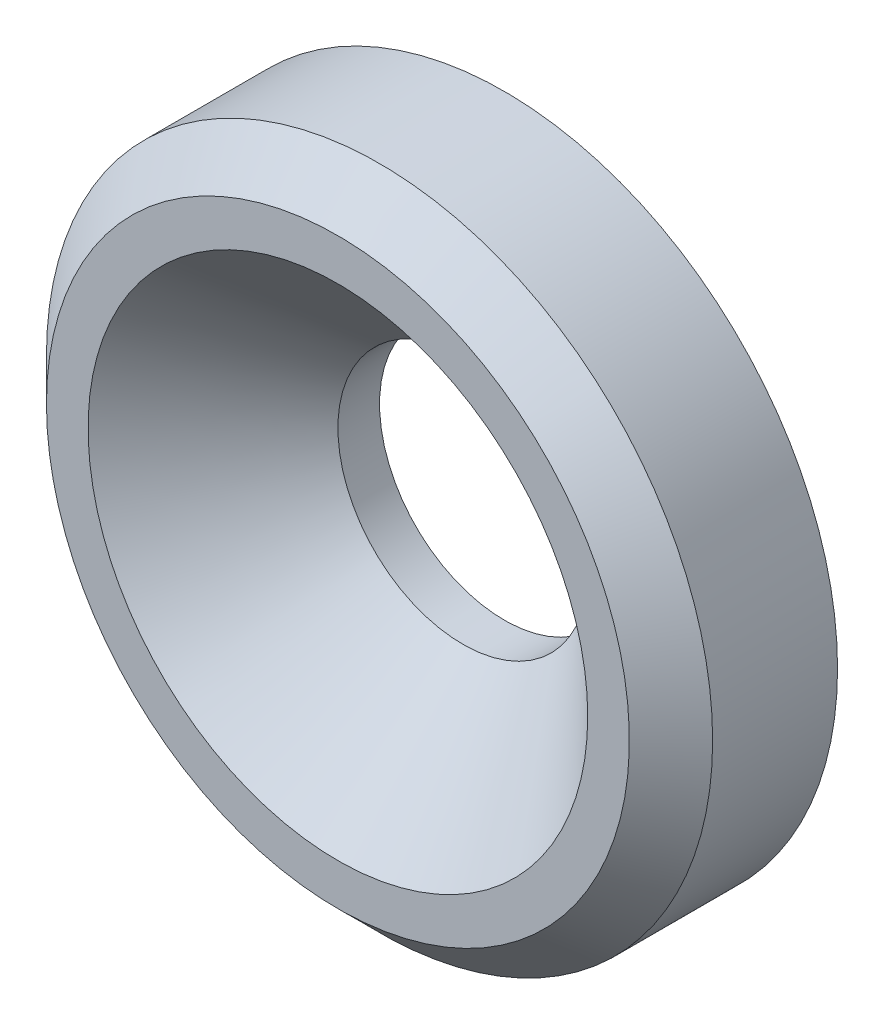
ISO-10303-21;
HEADER;
FILE_DESCRIPTION(('STEP AP214'),'2;1');
FILE_NAME('part.step','',(''),(''),'','','');
FILE_SCHEMA(('AUTOMOTIVE_DESIGN { 1 0 10303 214 1 1 1 1 }'));
ENDSEC;
DATA;
#1=APPLICATION_CONTEXT('core data for automotive mechanical design processes');
#2=APPLICATION_PROTOCOL_DEFINITION('international standard','automotive_design',2000,#1);
#3=PRODUCT_CONTEXT('',#1,'mechanical');
#4=PRODUCT('Part','Part','',(#3));
#5=PRODUCT_RELATED_PRODUCT_CATEGORY('part','',(#4));
#6=PRODUCT_DEFINITION_FORMATION('','',#4);
#7=PRODUCT_DEFINITION_CONTEXT('part definition',#1,'design');
#8=PRODUCT_DEFINITION('design','',#6,#7);
#9=PRODUCT_DEFINITION_SHAPE('','',#8);
#10=(LENGTH_UNIT() NAMED_UNIT(*) SI_UNIT(.MILLI.,.METRE.));
#11=(NAMED_UNIT(*) PLANE_ANGLE_UNIT() SI_UNIT($,.RADIAN.));
#12=(NAMED_UNIT(*) SI_UNIT($,.STERADIAN.) SOLID_ANGLE_UNIT());
#13=UNCERTAINTY_MEASURE_WITH_UNIT(LENGTH_MEASURE(1.E-05),#10,'distance_accuracy_value','');
#14=(GEOMETRIC_REPRESENTATION_CONTEXT(3) GLOBAL_UNCERTAINTY_ASSIGNED_CONTEXT((#13)) GLOBAL_UNIT_ASSIGNED_CONTEXT((#10,
#11,#12)) REPRESENTATION_CONTEXT('',''));
#15=CARTESIAN_POINT('',(0.,0.,0.));
#16=DIRECTION('',(0.,0.,1.));
#17=DIRECTION('',(1.,0.,0.));
#18=AXIS2_PLACEMENT_3D('',#15,#16,#17);
#19=CARTESIAN_POINT('',(0.,0.,2.));
#20=DIRECTION('',(0.,0.,1.));
#21=DIRECTION('',(1.,0.,0.));
#22=AXIS2_PLACEMENT_3D('',#19,#20,#21);
#23=PLANE('',#22);
#24=CARTESIAN_POINT('',(0.,0.,2.00000000000955));
#25=DIRECTION('',(0.,0.,1.));
#26=DIRECTION('',(1.,0.,0.));
#27=AXIS2_PLACEMENT_3D('',#24,#25,#26);
#28=CIRCLE('',#27,2.9999999999859);
#29=CARTESIAN_POINT('',(2.9999999999859,0.,2.00000000000955));
#30=VERTEX_POINT('',#29);
#31=EDGE_CURVE('E32',#30,#30,#28,.F.);
#32=ORIENTED_EDGE('',*,*,#31,.T.);
#33=EDGE_LOOP('',(#32));
#34=FACE_BOUND('',#33,.T.);
#35=CARTESIAN_POINT('',(0.,0.,2.00000000000955));
#36=DIRECTION('',(0.,0.,-1.));
#37=DIRECTION('',(-1.,0.,0.));
#38=AXIS2_PLACEMENT_3D('',#35,#36,#37);
#39=CIRCLE('',#38,3.49999999997408);
#40=CARTESIAN_POINT('',(-3.49999999997408,0.,2.00000000000955));
#41=VERTEX_POINT('',#40);
#42=EDGE_CURVE('E18',#41,#41,#39,.T.);
#43=ORIENTED_EDGE('',*,*,#42,.F.);
#44=EDGE_LOOP('',(#43));
#45=FACE_BOUND('',#44,.T.);
#46=ADVANCED_FACE('F15',(#34,#45),#23,.T.);
#47=CARTESIAN_POINT('',(0.,0.,1.50000000007822));
#48=DIRECTION('',(0.,0.,-1.));
#49=DIRECTION('',(-1.,0.,0.));
#50=AXIS2_PLACEMENT_3D('',#47,#48,#49);
#51=CONICAL_SURFACE('',#50,3.99999999990541,0.785398163397448);
#52=CARTESIAN_POINT('',(0.,0.,1.5));
#53=DIRECTION('',(0.,0.,1.));
#54=DIRECTION('',(1.,0.,0.));
#55=AXIS2_PLACEMENT_3D('',#52,#53,#54);
#56=CIRCLE('',#55,4.);
#57=CARTESIAN_POINT('',(4.,0.,1.5));
#58=VERTEX_POINT('',#57);
#59=EDGE_CURVE('E30',#58,#58,#56,.F.);
#60=ORIENTED_EDGE('',*,*,#59,.F.);
#61=EDGE_LOOP('',(#60));
#62=FACE_BOUND('',#61,.T.);
#63=ORIENTED_EDGE('',*,*,#42,.T.);
#64=EDGE_LOOP('',(#63));
#65=FACE_BOUND('',#64,.T.);
#66=ADVANCED_FACE('F40',(#62,#65),#51,.T.);
#67=CARTESIAN_POINT('',(0.,0.,2.00000000000955));
#68=DIRECTION('',(0.,0.,1.));
#69=DIRECTION('',(1.,0.,0.));
#70=AXIS2_PLACEMENT_3D('',#67,#68,#69);
#71=CONICAL_SURFACE('',#70,2.9999999999859,0.785398163397448);
#72=CARTESIAN_POINT('',(0.,0.,0.5));
#73=DIRECTION('',(0.,0.,1.));
#74=DIRECTION('',(1.,0.,0.));
#75=AXIS2_PLACEMENT_3D('',#72,#73,#74);
#76=CIRCLE('',#75,1.5);
#77=CARTESIAN_POINT('',(1.5,0.,0.5));
#78=VERTEX_POINT('',#77);
#79=EDGE_CURVE('E27',#78,#78,#76,.F.);
#80=ORIENTED_EDGE('',*,*,#79,.T.);
#81=EDGE_LOOP('',(#80));
#82=FACE_BOUND('',#81,.T.);
#83=ORIENTED_EDGE('',*,*,#31,.F.);
#84=EDGE_LOOP('',(#83));
#85=FACE_BOUND('',#84,.T.);
#86=ADVANCED_FACE('F47',(#82,#85),#71,.F.);
#87=CARTESIAN_POINT('',(0.,0.,0.));
#88=DIRECTION('',(0.,0.,1.));
#89=DIRECTION('',(1.,0.,0.));
#90=AXIS2_PLACEMENT_3D('',#87,#88,#89);
#91=CYLINDRICAL_SURFACE('',#90,4.);
#92=CARTESIAN_POINT('',(0.,0.,0.));
#93=DIRECTION('',(0.,0.,1.));
#94=DIRECTION('',(1.,0.,0.));
#95=AXIS2_PLACEMENT_3D('',#92,#93,#94);
#96=CIRCLE('',#95,4.);
#97=CARTESIAN_POINT('',(4.,0.,0.));
#98=VERTEX_POINT('',#97);
#99=EDGE_CURVE('E22',#98,#98,#96,.T.);
#100=ORIENTED_EDGE('',*,*,#99,.T.);
#101=EDGE_LOOP('',(#100));
#102=FACE_BOUND('',#101,.T.);
#103=ORIENTED_EDGE('',*,*,#59,.T.);
#104=EDGE_LOOP('',(#103));
#105=FACE_BOUND('',#104,.T.);
#106=ADVANCED_FACE('F57',(#102,#105),#91,.T.);
#107=CARTESIAN_POINT('',(0.,0.,0.));
#108=DIRECTION('',(0.,0.,1.));
#109=DIRECTION('',(1.,0.,0.));
#110=AXIS2_PLACEMENT_3D('',#107,#108,#109);
#111=CYLINDRICAL_SURFACE('',#110,1.5);
#112=CARTESIAN_POINT('',(0.,0.,0.));
#113=DIRECTION('',(0.,0.,1.));
#114=DIRECTION('',(1.,0.,0.));
#115=AXIS2_PLACEMENT_3D('',#112,#113,#114);
#116=CIRCLE('',#115,1.5);
#117=CARTESIAN_POINT('',(1.5,0.,0.));
#118=VERTEX_POINT('',#117);
#119=EDGE_CURVE('E10',#118,#118,#116,.F.);
#120=ORIENTED_EDGE('',*,*,#119,.T.);
#121=EDGE_LOOP('',(#120));
#122=FACE_BOUND('',#121,.T.);
#123=ORIENTED_EDGE('',*,*,#79,.F.);
#124=EDGE_LOOP('',(#123));
#125=FACE_BOUND('',#124,.T.);
#126=ADVANCED_FACE('F51',(#122,#125),#111,.F.);
#127=CARTESIAN_POINT('',(0.,0.,0.));
#128=DIRECTION('',(0.,0.,1.));
#129=DIRECTION('',(1.,0.,0.));
#130=AXIS2_PLACEMENT_3D('',#127,#128,#129);
#131=PLANE('',#130);
#132=ORIENTED_EDGE('',*,*,#119,.F.);
#133=EDGE_LOOP('',(#132));
#134=FACE_BOUND('',#133,.T.);
#135=ORIENTED_EDGE('',*,*,#99,.F.);
#136=EDGE_LOOP('',(#135));
#137=FACE_BOUND('',#136,.T.);
#138=ADVANCED_FACE('F49',(#134,#137),#131,.F.);
#139=CLOSED_SHELL('',(#46,#66,#86,#106,#126,#138));
#140=MANIFOLD_SOLID_BREP('B1',#139);
#141=ADVANCED_BREP_SHAPE_REPRESENTATION('',(#18,#140),#14);
#142=SHAPE_DEFINITION_REPRESENTATION(#9,#141);
ENDSEC;
END-ISO-10303-21;
